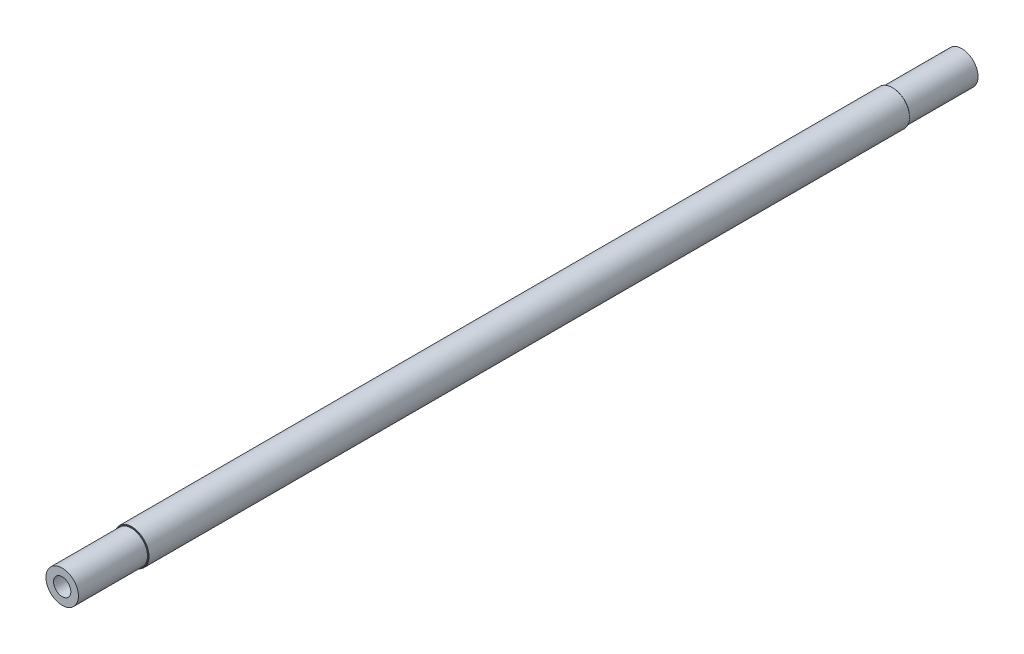
ISO-10303-21;
HEADER;
FILE_DESCRIPTION(('STEP AP214'),'2;1');
FILE_NAME('part.step','',(''),(''),'','','');
FILE_SCHEMA(('AUTOMOTIVE_DESIGN { 1 0 10303 214 1 1 1 1 }'));
ENDSEC;
DATA;
#1=APPLICATION_CONTEXT('core data for automotive mechanical design processes');
#2=APPLICATION_PROTOCOL_DEFINITION('international standard','automotive_design',2000,#1);
#3=PRODUCT_CONTEXT('',#1,'mechanical');
#4=PRODUCT('Part','Part','',(#3));
#5=PRODUCT_RELATED_PRODUCT_CATEGORY('part','',(#4));
#6=PRODUCT_DEFINITION_FORMATION('','',#4);
#7=PRODUCT_DEFINITION_CONTEXT('part definition',#1,'design');
#8=PRODUCT_DEFINITION('design','',#6,#7);
#9=PRODUCT_DEFINITION_SHAPE('','',#8);
#10=(LENGTH_UNIT() NAMED_UNIT(*) SI_UNIT(.MILLI.,.METRE.));
#11=(NAMED_UNIT(*) PLANE_ANGLE_UNIT() SI_UNIT($,.RADIAN.));
#12=(NAMED_UNIT(*) SI_UNIT($,.STERADIAN.) SOLID_ANGLE_UNIT());
#13=UNCERTAINTY_MEASURE_WITH_UNIT(LENGTH_MEASURE(1.E-05),#10,'distance_accuracy_value','');
#14=(GEOMETRIC_REPRESENTATION_CONTEXT(3) GLOBAL_UNCERTAINTY_ASSIGNED_CONTEXT((#13)) GLOBAL_UNIT_ASSIGNED_CONTEXT((#10,
#11,#12)) REPRESENTATION_CONTEXT('',''));
#15=CARTESIAN_POINT('',(0.,0.,0.));
#16=DIRECTION('',(0.,0.,1.));
#17=DIRECTION('',(1.,0.,0.));
#18=AXIS2_PLACEMENT_3D('',#15,#16,#17);
#19=CARTESIAN_POINT('',(0.,0.,2082.));
#20=DIRECTION('',(0.,0.,-1.));
#21=DIRECTION('',(-1.,0.,0.));
#22=AXIS2_PLACEMENT_3D('',#19,#20,#21);
#23=CYLINDRICAL_SURFACE('',#22,40.);
#24=CARTESIAN_POINT('',(0.,0.,1921.));
#25=DIRECTION('',(0.,0.,1.));
#26=DIRECTION('',(1.,0.,0.));
#27=AXIS2_PLACEMENT_3D('',#24,#25,#26);
#28=CIRCLE('',#27,40.);
#29=CARTESIAN_POINT('',(40.,0.,1921.));
#30=VERTEX_POINT('',#29);
#31=EDGE_CURVE('E40',#30,#30,#28,.F.);
#32=ORIENTED_EDGE('',*,*,#31,.T.);
#33=EDGE_LOOP('',(#32));
#34=FACE_BOUND('',#33,.T.);
#35=CARTESIAN_POINT('',(0.,0.,161.));
#36=DIRECTION('',(0.,0.,-1.));
#37=DIRECTION('',(-1.,0.,0.));
#38=AXIS2_PLACEMENT_3D('',#35,#36,#37);
#39=CIRCLE('',#38,40.);
#40=CARTESIAN_POINT('',(-40.,0.,161.));
#41=VERTEX_POINT('',#40);
#42=EDGE_CURVE('E44',#41,#41,#39,.F.);
#43=ORIENTED_EDGE('',*,*,#42,.T.);
#44=EDGE_LOOP('',(#43));
#45=FACE_BOUND('',#44,.T.);
#46=ADVANCED_FACE('F33',(#34,#45),#23,.T.);
#47=CARTESIAN_POINT('',(0.,0.,2082.));
#48=DIRECTION('',(0.,0.,1.));
#49=DIRECTION('',(1.,0.,0.));
#50=AXIS2_PLACEMENT_3D('',#47,#48,#49);
#51=PLANE('',#50);
#52=CARTESIAN_POINT('',(0.,0.,2082.));
#53=DIRECTION('',(0.,0.,1.));
#54=DIRECTION('',(1.,0.,0.));
#55=AXIS2_PLACEMENT_3D('',#52,#53,#54);
#56=CIRCLE('',#55,20.);
#57=CARTESIAN_POINT('',(20.,0.,2082.));
#58=VERTEX_POINT('',#57);
#59=EDGE_CURVE('E53',#58,#58,#56,.T.);
#60=ORIENTED_EDGE('',*,*,#59,.F.);
#61=EDGE_LOOP('',(#60));
#62=FACE_BOUND('',#61,.T.);
#63=CARTESIAN_POINT('',(0.,0.,2082.));
#64=DIRECTION('',(0.,0.,1.));
#65=DIRECTION('',(1.,0.,0.));
#66=AXIS2_PLACEMENT_3D('',#63,#64,#65);
#67=CIRCLE('',#66,37.5);
#68=CARTESIAN_POINT('',(37.5,0.,2082.));
#69=VERTEX_POINT('',#68);
#70=EDGE_CURVE('E66',#69,#69,#67,.T.);
#71=ORIENTED_EDGE('',*,*,#70,.T.);
#72=EDGE_LOOP('',(#71));
#73=FACE_BOUND('',#72,.T.);
#74=ADVANCED_FACE('F90',(#62,#73),#51,.T.);
#75=CARTESIAN_POINT('',(0.,0.,0.));
#76=DIRECTION('',(0.,0.,1.));
#77=DIRECTION('',(1.,0.,0.));
#78=AXIS2_PLACEMENT_3D('',#75,#76,#77);
#79=PLANE('',#78);
#80=CARTESIAN_POINT('',(0.,0.,0.));
#81=DIRECTION('',(0.,0.,1.));
#82=DIRECTION('',(1.,0.,0.));
#83=AXIS2_PLACEMENT_3D('',#80,#81,#82);
#84=CIRCLE('',#83,20.);
#85=CARTESIAN_POINT('',(20.,0.,0.));
#86=VERTEX_POINT('',#85);
#87=EDGE_CURVE('E54',#86,#86,#84,.T.);
#88=ORIENTED_EDGE('',*,*,#87,.T.);
#89=EDGE_LOOP('',(#88));
#90=FACE_BOUND('',#89,.T.);
#91=CARTESIAN_POINT('',(0.,0.,0.));
#92=DIRECTION('',(0.,0.,-1.));
#93=DIRECTION('',(-1.,0.,0.));
#94=AXIS2_PLACEMENT_3D('',#91,#92,#93);
#95=CIRCLE('',#94,37.5);
#96=CARTESIAN_POINT('',(-37.5,0.,0.));
#97=VERTEX_POINT('',#96);
#98=EDGE_CURVE('E60',#97,#97,#95,.T.);
#99=ORIENTED_EDGE('',*,*,#98,.T.);
#100=EDGE_LOOP('',(#99));
#101=FACE_BOUND('',#100,.T.);
#102=ADVANCED_FACE('F95',(#90,#101),#79,.F.);
#103=CARTESIAN_POINT('',(0.,0.,2082.));
#104=DIRECTION('',(0.,0.,-1.));
#105=DIRECTION('',(-1.,0.,0.));
#106=AXIS2_PLACEMENT_3D('',#103,#104,#105);
#107=CYLINDRICAL_SURFACE('',#106,20.);
#108=ORIENTED_EDGE('',*,*,#59,.T.);
#109=EDGE_LOOP('',(#108));
#110=FACE_BOUND('',#109,.T.);
#111=ORIENTED_EDGE('',*,*,#87,.F.);
#112=EDGE_LOOP('',(#111));
#113=FACE_BOUND('',#112,.T.);
#114=ADVANCED_FACE('F130',(#110,#113),#107,.F.);
#115=CARTESIAN_POINT('',(0.,0.,160.));
#116=DIRECTION('',(0.,0.,-1.));
#117=DIRECTION('',(-1.,0.,0.));
#118=AXIS2_PLACEMENT_3D('',#115,#116,#117);
#119=PLANE('',#118);
#120=CARTESIAN_POINT('',(0.,0.,160.));
#121=DIRECTION('',(0.,0.,-1.));
#122=DIRECTION('',(-1.,0.,0.));
#123=AXIS2_PLACEMENT_3D('',#120,#121,#122);
#124=CIRCLE('',#123,39.);
#125=CARTESIAN_POINT('',(-39.,0.,160.));
#126=VERTEX_POINT('',#125);
#127=EDGE_CURVE('E10',#126,#126,#124,.T.);
#128=ORIENTED_EDGE('',*,*,#127,.T.);
#129=EDGE_LOOP('',(#128));
#130=FACE_BOUND('',#129,.T.);
#131=CARTESIAN_POINT('',(0.,0.,160.));
#132=DIRECTION('',(0.,0.,-1.));
#133=DIRECTION('',(-1.,0.,0.));
#134=AXIS2_PLACEMENT_3D('',#131,#132,#133);
#135=CIRCLE('',#134,37.5);
#136=CARTESIAN_POINT('',(-37.5,0.,160.));
#137=VERTEX_POINT('',#136);
#138=EDGE_CURVE('E57',#137,#137,#135,.T.);
#139=ORIENTED_EDGE('',*,*,#138,.F.);
#140=EDGE_LOOP('',(#139));
#141=FACE_BOUND('',#140,.T.);
#142=ADVANCED_FACE('F86',(#130,#141),#119,.T.);
#143=CARTESIAN_POINT('',(0.,0.,160.));
#144=DIRECTION('',(0.,0.,-1.));
#145=DIRECTION('',(-1.,0.,0.));
#146=AXIS2_PLACEMENT_3D('',#143,#144,#145);
#147=CYLINDRICAL_SURFACE('',#146,37.5);
#148=ORIENTED_EDGE('',*,*,#138,.T.);
#149=EDGE_LOOP('',(#148));
#150=FACE_BOUND('',#149,.T.);
#151=ORIENTED_EDGE('',*,*,#98,.F.);
#152=EDGE_LOOP('',(#151));
#153=FACE_BOUND('',#152,.T.);
#154=ADVANCED_FACE('F77',(#150,#153),#147,.T.);
#155=CARTESIAN_POINT('',(0.,0.,1922.));
#156=DIRECTION('',(0.,0.,1.));
#157=DIRECTION('',(1.,0.,0.));
#158=AXIS2_PLACEMENT_3D('',#155,#156,#157);
#159=PLANE('',#158);
#160=CARTESIAN_POINT('',(0.,0.,1922.));
#161=DIRECTION('',(0.,0.,1.));
#162=DIRECTION('',(1.,0.,0.));
#163=AXIS2_PLACEMENT_3D('',#160,#161,#162);
#164=CIRCLE('',#163,39.0000000000001);
#165=CARTESIAN_POINT('',(39.0000000000001,0.,1922.));
#166=VERTEX_POINT('',#165);
#167=EDGE_CURVE('E48',#166,#166,#164,.T.);
#168=ORIENTED_EDGE('',*,*,#167,.T.);
#169=EDGE_LOOP('',(#168));
#170=FACE_BOUND('',#169,.T.);
#171=CARTESIAN_POINT('',(0.,0.,1922.));
#172=DIRECTION('',(0.,0.,1.));
#173=DIRECTION('',(1.,0.,0.));
#174=AXIS2_PLACEMENT_3D('',#171,#172,#173);
#175=CIRCLE('',#174,37.5);
#176=CARTESIAN_POINT('',(37.5,0.,1922.));
#177=VERTEX_POINT('',#176);
#178=EDGE_CURVE('E63',#177,#177,#175,.T.);
#179=ORIENTED_EDGE('',*,*,#178,.F.);
#180=EDGE_LOOP('',(#179));
#181=FACE_BOUND('',#180,.T.);
#182=ADVANCED_FACE('F75',(#170,#181),#159,.T.);
#183=CARTESIAN_POINT('',(0.,0.,1922.));
#184=DIRECTION('',(0.,0.,1.));
#185=DIRECTION('',(1.,0.,0.));
#186=AXIS2_PLACEMENT_3D('',#183,#184,#185);
#187=CYLINDRICAL_SURFACE('',#186,37.5);
#188=ORIENTED_EDGE('',*,*,#178,.T.);
#189=EDGE_LOOP('',(#188));
#190=FACE_BOUND('',#189,.T.);
#191=ORIENTED_EDGE('',*,*,#70,.F.);
#192=EDGE_LOOP('',(#191));
#193=FACE_BOUND('',#192,.T.);
#194=ADVANCED_FACE('F72',(#190,#193),#187,.T.);
#195=CARTESIAN_POINT('',(0.,0.,1922.));
#196=DIRECTION('',(0.,0.,-1.));
#197=DIRECTION('',(-1.,0.,0.));
#198=AXIS2_PLACEMENT_3D('',#195,#196,#197);
#199=CONICAL_SURFACE('',#198,39.0000000000001,0.785398163397542);
#200=ORIENTED_EDGE('',*,*,#31,.F.);
#201=EDGE_LOOP('',(#200));
#202=FACE_BOUND('',#201,.T.);
#203=ORIENTED_EDGE('',*,*,#167,.F.);
#204=EDGE_LOOP('',(#203));
#205=FACE_BOUND('',#204,.T.);
#206=ADVANCED_FACE('F84',(#202,#205),#199,.T.);
#207=CARTESIAN_POINT('',(0.,0.,160.));
#208=DIRECTION('',(0.,0.,1.));
#209=DIRECTION('',(1.,0.,0.));
#210=AXIS2_PLACEMENT_3D('',#207,#208,#209);
#211=CONICAL_SURFACE('',#210,38.9999999999999,0.785398163397431);
#212=ORIENTED_EDGE('',*,*,#42,.F.);
#213=EDGE_LOOP('',(#212));
#214=FACE_BOUND('',#213,.T.);
#215=ORIENTED_EDGE('',*,*,#127,.F.);
#216=EDGE_LOOP('',(#215));
#217=FACE_BOUND('',#216,.T.);
#218=ADVANCED_FACE('F35',(#214,#217),#211,.T.);
#219=CLOSED_SHELL('',(#46,#74,#102,#114,#142,#154,#182,#194,#206,#218));
#220=MANIFOLD_SOLID_BREP('B2',#219);
#221=ADVANCED_BREP_SHAPE_REPRESENTATION('',(#18,#220),#14);
#222=SHAPE_DEFINITION_REPRESENTATION(#9,#221);
ENDSEC;
END-ISO-10303-21;
